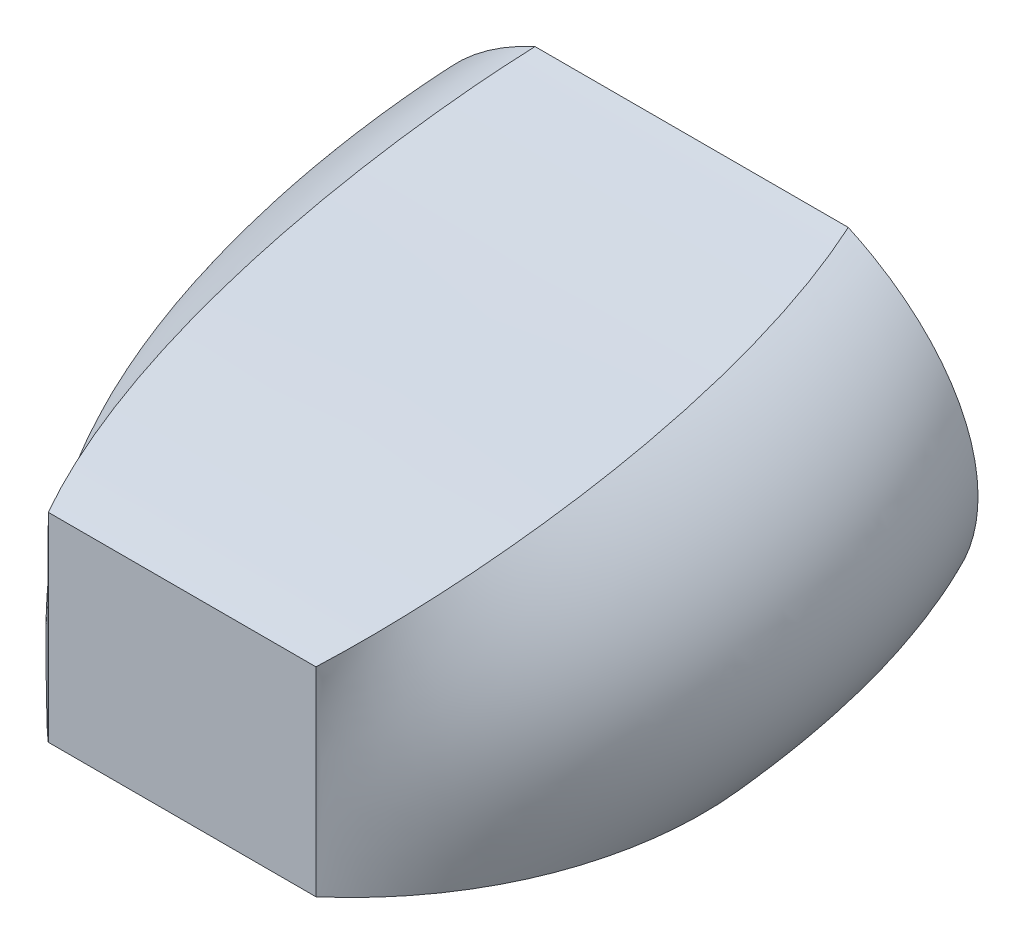
ISO-10303-21;
HEADER;
FILE_DESCRIPTION(('STEP AP214'),'2;1');
FILE_NAME('part.step','',(''),(''),'','','');
FILE_SCHEMA(('AUTOMOTIVE_DESIGN { 1 0 10303 214 1 1 1 1 }'));
ENDSEC;
DATA;
#1=APPLICATION_CONTEXT('core data for automotive mechanical design processes');
#2=APPLICATION_PROTOCOL_DEFINITION('international standard','automotive_design',2000,#1);
#3=PRODUCT_CONTEXT('',#1,'mechanical');
#4=PRODUCT('Part','Part','',(#3));
#5=PRODUCT_RELATED_PRODUCT_CATEGORY('part','',(#4));
#6=PRODUCT_DEFINITION_FORMATION('','',#4);
#7=PRODUCT_DEFINITION_CONTEXT('part definition',#1,'design');
#8=PRODUCT_DEFINITION('design','',#6,#7);
#9=PRODUCT_DEFINITION_SHAPE('','',#8);
#10=(LENGTH_UNIT() NAMED_UNIT(*) SI_UNIT(.MILLI.,.METRE.));
#11=(NAMED_UNIT(*) PLANE_ANGLE_UNIT() SI_UNIT($,.RADIAN.));
#12=(NAMED_UNIT(*) SI_UNIT($,.STERADIAN.) SOLID_ANGLE_UNIT());
#13=UNCERTAINTY_MEASURE_WITH_UNIT(LENGTH_MEASURE(1.E-05),#10,'distance_accuracy_value','');
#14=(GEOMETRIC_REPRESENTATION_CONTEXT(3) GLOBAL_UNCERTAINTY_ASSIGNED_CONTEXT((#13)) GLOBAL_UNIT_ASSIGNED_CONTEXT((#10,
#11,#12)) REPRESENTATION_CONTEXT('',''));
#15=CARTESIAN_POINT('',(0.,0.,0.));
#16=DIRECTION('',(0.,0.,1.));
#17=DIRECTION('',(1.,0.,0.));
#18=AXIS2_PLACEMENT_3D('',#15,#16,#17);
#19=CARTESIAN_POINT('',(20.015210778448,-25.1491537240854,76.2));
#20=DIRECTION('',(0.,0.,1.));
#21=DIRECTION('',(1.,0.,0.));
#22=AXIS2_PLACEMENT_3D('',#19,#20,#21);
#23=PLANE('',#22);
#24=DIRECTION('',(0.,1.,0.));
#25=VECTOR('',#24,1.);
#26=CARTESIAN_POINT('',(20.015210778448,4.63456534564599,76.2));
#27=LINE('',#26,#25);
#28=CARTESIAN_POINT('',(20.015210778448,-25.1491537240854,76.2));
#29=VERTEX_POINT('',#28);
#30=CARTESIAN_POINT('',(20.015210778448,4.63456534564599,76.2));
#31=VERTEX_POINT('',#30);
#32=EDGE_CURVE('E312',#29,#31,#27,.T.);
#33=ORIENTED_EDGE('',*,*,#32,.T.);
#34=DIRECTION('',(-1.,0.,0.));
#35=VECTOR('',#34,1.);
#36=CARTESIAN_POINT('',(-20.015210778448,4.63456534564599,76.2));
#37=LINE('',#36,#35);
#38=CARTESIAN_POINT('',(-20.015210778448,4.63456534564599,76.2));
#39=VERTEX_POINT('',#38);
#40=EDGE_CURVE('E96',#31,#39,#37,.T.);
#41=ORIENTED_EDGE('',*,*,#40,.T.);
#42=DIRECTION('',(0.,-1.,0.));
#43=VECTOR('',#42,1.);
#44=CARTESIAN_POINT('',(-20.015210778448,4.63456534564599,76.2));
#45=LINE('',#44,#43);
#46=CARTESIAN_POINT('',(-20.015210778448,-25.1491537240854,76.2));
#47=VERTEX_POINT('',#46);
#48=EDGE_CURVE('E186',#39,#47,#45,.T.);
#49=ORIENTED_EDGE('',*,*,#48,.T.);
#50=DIRECTION('',(1.,0.,0.));
#51=VECTOR('',#50,1.);
#52=CARTESIAN_POINT('',(-20.015210778448,-25.1491537240854,76.2));
#53=LINE('',#52,#51);
#54=EDGE_CURVE('E199',#47,#29,#53,.T.);
#55=ORIENTED_EDGE('',*,*,#54,.T.);
#56=EDGE_LOOP('',(#33,#41,#49,#55));
#57=FACE_BOUND('',#56,.T.);
#58=ADVANCED_FACE('F59',(#57),#23,.T.);
#59=CARTESIAN_POINT('',(0.,0.,0.));
#60=DIRECTION('',(0.,0.,1.));
#61=DIRECTION('',(1.,0.,0.));
#62=AXIS2_PLACEMENT_3D('',#59,#60,#61);
#63=PLANE('',#62);
#64=CARTESIAN_POINT('',(0.,0.,0.));
#65=DIRECTION('',(0.,0.,1.));
#66=DIRECTION('',(1.,0.,0.));
#67=AXIS2_PLACEMENT_3D('',#64,#65,#66);
#68=ELLIPSE('',#67,42.8215320166859,30.0430430974209);
#69=CARTESIAN_POINT('',(23.4252478371519,-25.1491537240854,0.));
#70=VERTEX_POINT('',#69);
#71=CARTESIAN_POINT('',(23.4252478371519,25.1491537240854,0.));
#72=VERTEX_POINT('',#71);
#73=EDGE_CURVE('E114',#70,#72,#68,.T.);
#74=ORIENTED_EDGE('',*,*,#73,.F.);
#75=DIRECTION('',(1.,0.,0.));
#76=VECTOR('',#75,1.);
#77=CARTESIAN_POINT('',(-23.4252478371519,-25.1491537240854,0.));
#78=LINE('',#77,#76);
#79=CARTESIAN_POINT('',(-23.4252478371519,-25.1491537240854,0.));
#80=VERTEX_POINT('',#79);
#81=EDGE_CURVE('E13',#80,#70,#78,.T.);
#82=ORIENTED_EDGE('',*,*,#81,.F.);
#83=CARTESIAN_POINT('',(0.,0.,0.));
#84=DIRECTION('',(0.,0.,1.));
#85=DIRECTION('',(1.,0.,0.));
#86=AXIS2_PLACEMENT_3D('',#83,#84,#85);
#87=ELLIPSE('',#86,42.8215320166859,30.0430430974209);
#88=CARTESIAN_POINT('',(-23.4252478371519,25.1491537240854,0.));
#89=VERTEX_POINT('',#88);
#90=EDGE_CURVE('E70',#89,#80,#87,.T.);
#91=ORIENTED_EDGE('',*,*,#90,.F.);
#92=DIRECTION('',(-1.,0.,0.));
#93=VECTOR('',#92,1.);
#94=CARTESIAN_POINT('',(-23.4252478371519,25.1491537240854,0.));
#95=LINE('',#94,#93);
#96=EDGE_CURVE('E111',#72,#89,#95,.T.);
#97=ORIENTED_EDGE('',*,*,#96,.F.);
#98=EDGE_LOOP('',(#74,#82,#91,#97));
#99=FACE_BOUND('',#98,.T.);
#100=ADVANCED_FACE('F113',(#99),#63,.F.);
#101=CARTESIAN_POINT('',(-23.4252478371519,25.1491537240854,0.));
#102=CARTESIAN_POINT('',(-25.3425063222502,22.8697550153699,6.92482771259224));
#103=CARTESIAN_POINT('',(-27.1969512669141,19.4506569522966,19.6986662011747));
#104=CARTESIAN_POINT('',(-27.2647219228197,14.8918595348657,38.8615590313737));
#105=CARTESIAN_POINT('',(-25.6199110200033,10.3330621174347,57.7891550462996));
#106=CARTESIAN_POINT('',(-22.636306515506,6.91396405436147,69.898422970451));
#107=CARTESIAN_POINT('',(-20.015210778448,4.63456534564599,76.2));
#108=CARTESIAN_POINT('',(-25.9671227602717,23.9837445426204,0.));
#109=CARTESIAN_POINT('',(-27.7997431154719,21.6959481546707,6.92489560917324));
#110=CARTESIAN_POINT('',(-29.4392954154369,18.2642535727463,19.698738284089));
#111=CARTESIAN_POINT('',(-29.0133491936614,13.6886607968471,38.861543002257));
#112=CARTESIAN_POINT('',(-26.727225920909,9.11306802094786,57.7890565396575));
#113=CARTESIAN_POINT('',(-23.1118719040217,5.68137343902345,69.8983430925569));
#114=CARTESIAN_POINT('',(-20.015210778448,3.39357705107385,76.2));
#115=CARTESIAN_POINT('',(-30.8500960427992,21.2068082327899,0.));
#116=CARTESIAN_POINT('',(-32.5357486452822,18.9517851471388,6.92503140233526));
#117=CARTESIAN_POINT('',(-33.7789784164681,15.569250518662,19.6988824499176));
#118=CARTESIAN_POINT('',(-32.4102154534886,11.0592043473597,38.8615109440237));
#119=CARTESIAN_POINT('',(-28.8860844550225,6.54915817605742,57.7888595263732));
#120=CARTESIAN_POINT('',(-24.0406941739738,3.16662354758071,69.8981833367687));
#121=CARTESIAN_POINT('',(-20.015210778448,0.911600461929568,76.2));
#122=CARTESIAN_POINT('',(-36.0917392739663,16.5029873541106,0.));
#123=CARTESIAN_POINT('',(-37.6894681157742,14.4258920620426,6.92520114378778));
#124=CARTESIAN_POINT('',(-38.5809736213183,11.3102491239407,19.6990626572033));
#125=CARTESIAN_POINT('',(-36.2252615922766,7.15605853980489,38.861470871232));
#126=CARTESIAN_POINT('',(-31.345192797111,3.00186795566902,57.7886132597679));
#127=CARTESIAN_POINT('',(-25.1059360811927,-0.11377498243286,69.8979836420335));
#128=CARTESIAN_POINT('',(-20.015210778448,-2.19087027450078,76.2));
#129=CARTESIAN_POINT('',(-39.4047843459119,11.9736946723841,0.));
#130=CARTESIAN_POINT('',(-41.029981902845,10.1240789461587,6.92533693694979));
#131=CARTESIAN_POINT('',(-41.7868195813737,7.34965535682046,19.6992068230318));
#132=CARTESIAN_POINT('',(-38.837163746813,3.65042390436954,38.8614388129987));
#133=CARTESIAN_POINT('',(-33.0679601616184,-0.0488075480814148,57.7884162464836));
#134=CARTESIAN_POINT('',(-25.8603218833024,-2.8232311374196,69.8978238862453));
#135=CARTESIAN_POINT('',(-20.015210778448,-4.67284686364506,76.2));
#136=CARTESIAN_POINT('',(-41.3194926440344,8.22672299423152,0.));
#137=CARTESIAN_POINT('',(-43.0286334601822,6.58660607203875,6.92543878182129));
#138=CARTESIAN_POINT('',(-43.7794828527555,4.12643068874962,19.6993149474033));
#139=CARTESIAN_POINT('',(-40.5110526097969,0.846196844364124,38.8614147693237));
#140=CARTESIAN_POINT('',(-34.2016813778221,-2.43403700002141,57.7882684865204));
#141=CARTESIAN_POINT('',(-26.362769512014,-4.89421238331052,69.8977040694042));
#142=CARTESIAN_POINT('',(-20.015210778448,-6.53432930550327,76.2));
#143=CARTESIAN_POINT('',(-42.54137331576,4.19409726075279,0.));
#144=CARTESIAN_POINT('',(-44.4114382385,2.79521848207342,6.9255406266928));
#145=CARTESIAN_POINT('',(-45.2717706161839,0.696900314054367,19.6994230717747));
#146=CARTESIAN_POINT('',(-41.8385276595824,-2.10085724330435,38.8613907256487));
#147=CARTESIAN_POINT('',(-35.1429504755822,-4.89861480066309,57.7881207265572));
#148=CARTESIAN_POINT('',(-26.7882362933481,-6.99693296868213,69.897584252563));
#149=CARTESIAN_POINT('',(-20.015210778448,-8.39581174736148,76.2));
#150=CARTESIAN_POINT('',(-42.9617026131352,0.,0.));
#151=CARTESIAN_POINT('',(-45.0817529062839,-1.13969935435774,6.92564247156431));
#152=CARTESIAN_POINT('',(-46.1851601648037,-2.84924838589436,19.6995311961461));
#153=CARTESIAN_POINT('',(-42.7652270221926,-5.12864709460984,38.8613666819737));
#154=CARTESIAN_POINT('',(-35.8615664138006,-7.40804580332535,57.787972966594));
#155=CARTESIAN_POINT('',(-27.1246418108655,-9.11759483486195,69.8974644357219));
#156=CARTESIAN_POINT('',(-20.015210778448,-10.2572941892197,76.2));
#157=CARTESIAN_POINT('',(-42.54137331576,-4.19409726075278,0.));
#158=CARTESIAN_POINT('',(-45.0048154898454,-5.07461719078892,6.92574431643582));
#159=CARTESIAN_POINT('',(-46.4914073949926,-6.39539708584311,19.6996393205175));
#160=CARTESIAN_POINT('',(-43.2715970874277,-8.15643694591534,38.8613426382987));
#161=CARTESIAN_POINT('',(-36.3466660756993,-9.91747680598761,57.7878252066308));
#162=CARTESIAN_POINT('',(-27.3676408178551,-11.2382567010418,69.8973446188807));
#163=CARTESIAN_POINT('',(-20.015210778448,-12.1187766310779,76.2));
#164=CARTESIAN_POINT('',(-41.3194926440344,-8.2267229942315,0.));
#165=CARTESIAN_POINT('',(-44.2153879628732,-8.86600478075424,6.92584616130733));
#166=CARTESIAN_POINT('',(-46.218756410373,-9.82492746053835,19.699747444889));
#167=CARTESIAN_POINT('',(-43.3771914654876,-11.1034910335838,38.8613185946237));
#168=CARTESIAN_POINT('',(-36.6091125780564,-12.3820546066293,57.7876774466676));
#169=CARTESIAN_POINT('',(-27.521578561028,-13.3409772864134,69.8972248020396));
#170=CARTESIAN_POINT('',(-20.015210778448,-13.9802590729361,76.2));
#171=CARTESIAN_POINT('',(-39.4047843459118,-11.9736946723841,0.));
#172=CARTESIAN_POINT('',(-42.8101136568814,-12.4034776548742,6.92594800617885));
#173=CARTESIAN_POINT('',(-45.4457299177999,-13.0481521286092,19.6998555692604));
#174=CARTESIAN_POINT('',(-43.1363720303489,-13.9077180935892,38.8612945509487));
#175=CARTESIAN_POINT('',(-36.6791069619698,-14.7672840585693,57.7875296867044));
#176=CARTESIAN_POINT('',(-27.5985354568234,-15.4119585323043,69.8971049851985));
#177=CARTESIAN_POINT('',(-20.015210778448,-15.8417415147943,76.2));
#178=CARTESIAN_POINT('',(-36.0917392739663,-16.5029873541105,0.));
#179=CARTESIAN_POINT('',(-40.2607695382713,-16.7052907707581,6.92608379934086));
#180=CARTESIAN_POINT('',(-43.8660663294895,-17.0087458957295,19.699999735089));
#181=CARTESIAN_POINT('',(-42.4352291129397,-17.4133527290246,38.8612624927154));
#182=CARTESIAN_POINT('',(-36.5612937309519,-17.8179595623197,57.7873326734201));
#183=CARTESIAN_POINT('',(-27.616689020723,-18.121414687291,69.8969452294103));
#184=CARTESIAN_POINT('',(-20.015210778448,-18.3237181039386,76.2000000000001));
#185=CARTESIAN_POINT('',(-30.8500960427992,-21.2068082327899,0.));
#186=CARTESIAN_POINT('',(-36.096012153355,-21.2311838558543,6.92625354079338));
#187=CARTESIAN_POINT('',(-41.0967990893205,-21.2677472904508,19.7001799423747));
#188=CARTESIAN_POINT('',(-41.0086320205606,-21.3164985365794,38.8612224199237));
#189=CARTESIAN_POINT('',(-36.1083780557253,-21.3652497827081,57.7870864068148));
#190=CARTESIAN_POINT('',(-27.5171213210158,-21.4018132173046,69.896745534675));
#191=CARTESIAN_POINT('',(-20.015210778448,-21.4261888403689,76.2));
#192=CARTESIAN_POINT('',(-25.9671227602718,-23.9837445426203,0.));
#193=CARTESIAN_POINT('',(-32.1511762920054,-23.9753468633862,6.92638933395539));
#194=CARTESIAN_POINT('',(-38.3832984600344,-23.9627503445351,19.7003241082033));
#195=CARTESIAN_POINT('',(-39.5225249978604,-23.9459549860668,38.8611903616904));
#196=CARTESIAN_POINT('',(-35.5544736551013,-23.9291596275986,57.7868893935305));
#197=CARTESIAN_POINT('',(-27.360838417073,-23.9165631087474,69.8965857788868));
#198=CARTESIAN_POINT('',(-20.015210778448,-23.9081654295132,76.2));
#199=CARTESIAN_POINT('',(-23.4252478371519,-25.1491537240854,0.));
#200=CARTESIAN_POINT('',(-30.089524333014,-25.1491537240854,6.92645723053639));
#201=CARTESIAN_POINT('',(-36.954045497384,-25.1491537240854,19.7003961911176));
#202=CARTESIAN_POINT('',(-38.7292773455823,-25.1491537240854,38.8611743325737));
#203=CARTESIAN_POINT('',(-35.2496358209404,-25.1491537240854,57.7867908868883));
#204=CARTESIAN_POINT('',(-27.271542711562,-25.1491537240854,69.8965059009927));
#205=CARTESIAN_POINT('',(-20.015210778448,-25.1491537240854,76.2));
#206=B_SPLINE_SURFACE_WITH_KNOTS('',3,3,((#101,#102,#103,#104,#105,#106,#107),(#108,#109,#110,
#111,#112,#113,#114),(#115,#116,#117,#118,#119,#120,#121),(#122,#123,#124,#125,#126,#127,#128),
(#129,#130,#131,#132,#133,#134,#135),(#136,#137,#138,#139,#140,#141,#142),(#143,#144,#145,#146,
#147,#148,#149),(#150,#151,#152,#153,#154,#155,#156),(#157,#158,#159,#160,#161,#162,#163),(#164,
#165,#166,#167,#168,#169,#170),(#171,#172,#173,#174,#175,#176,#177),(#178,#179,#180,#181,#182,
#183,#184),(#185,#186,#187,#188,#189,#190,#191),(#192,#193,#194,#195,#196,#197,#198),(#199,#200,
#201,#202,#203,#204,#205)),.UNSPECIFIED.,.F.,.F.,.F.,(4,1,1,1,1,1,1,1,1,1,1,1,4),(4,1,1,1,4),
(0.663239265490943,0.705334357304576,0.747429449118208,0.768476995025024,0.78952454093184,
0.810572086838656,0.831619632745472,0.852667178652288,0.873714724559104,0.89476227046592,
0.915809816372736,0.957904908186368,1.),(0.,0.333333333333333,0.5,0.666666666666667,1.),.UNSPECIFIED.);
#207=CARTESIAN_POINT('',(-23.4252478371519,-25.1491537240854,0.));
#208=CARTESIAN_POINT('',(-30.089524333014,-25.1491537240854,6.92645723053639));
#209=CARTESIAN_POINT('',(-36.954045497384,-25.1491537240854,19.7003961911176));
#210=CARTESIAN_POINT('',(-38.7292773455823,-25.1491537240854,38.8611743325737));
#211=CARTESIAN_POINT('',(-35.2496358209404,-25.1491537240854,57.7867908868883));
#212=CARTESIAN_POINT('',(-27.271542711562,-25.1491537240854,69.8965059009927));
#213=CARTESIAN_POINT('',(-20.015210778448,-25.1491537240854,76.2));
#214=B_SPLINE_CURVE_WITH_KNOTS('',3,(#207,#208,#209,#210,#211,#212,#213),.UNSPECIFIED.,.F.,.F.,
(4,1,1,1,4),(0.,0.333333333333333,0.5,0.666666666666667,1.),.UNSPECIFIED.);
#215=EDGE_CURVE('E125',#80,#47,#214,.T.);
#216=CARTESIAN_POINT('',(-23.4252478371519,25.1491537240854,0.));
#217=CARTESIAN_POINT('',(-25.3425063222502,22.8697550153699,6.92482771259224));
#218=CARTESIAN_POINT('',(-27.1969512669141,19.4506569522966,19.6986662011747));
#219=CARTESIAN_POINT('',(-27.2647219228197,14.8918595348657,38.8615590313737));
#220=CARTESIAN_POINT('',(-25.6199110200033,10.3330621174347,57.7891550462996));
#221=CARTESIAN_POINT('',(-22.636306515506,6.91396405436147,69.898422970451));
#222=CARTESIAN_POINT('',(-20.015210778448,4.63456534564599,76.2));
#223=B_SPLINE_CURVE_WITH_KNOTS('',3,(#216,#217,#218,#219,#220,#221,#222),.UNSPECIFIED.,.F.,.F.,
(4,1,1,1,4),(0.,0.333333333333333,0.5,0.666666666666667,1.),.UNSPECIFIED.);
#224=EDGE_CURVE('E131',#89,#39,#223,.T.);
#225=ORIENTED_EDGE('',*,*,#90,.T.);
#226=ORIENTED_EDGE('',*,*,#215,.T.);
#227=ORIENTED_EDGE('',*,*,#48,.F.);
#228=ORIENTED_EDGE('',*,*,#224,.F.);
#229=EDGE_LOOP('',(#225,#226,#227,#228));
#230=FACE_BOUND('',#229,.T.);
#231=ADVANCED_FACE('F159',(#230),#206,.T.);
#232=CARTESIAN_POINT('',(23.4252478371519,25.1491537240854,0.));
#233=CARTESIAN_POINT('',(25.3522822273266,22.8697550153699,6.92324794817762));
#234=CARTESIAN_POINT('',(27.2182634915339,19.4506569522966,19.6969890324395));
#235=CARTESIAN_POINT('',(27.2902486570107,14.8918595348657,38.8619319842931));
#236=CARTESIAN_POINT('',(25.6406791851697,10.3330621174347,57.7914470216178));
#237=CARTESIAN_POINT('',(22.6456111250246,6.91396405436147,69.900281506665));
#238=CARTESIAN_POINT('',(20.015210778448,4.63456534564599,76.2));
#239=CARTESIAN_POINT('',(19.5210398642932,25.1491537240854,0.));
#240=CARTESIAN_POINT('',(21.1277165148619,22.8697550153699,6.92337959521217));
#241=CARTESIAN_POINT('',(22.6836622616633,19.4506569522966,19.6971287965008));
#242=CARTESIAN_POINT('',(22.7440011086915,14.8918595348657,38.8619009048831));
#243=CARTESIAN_POINT('',(21.3689633347386,10.3330621174347,57.7912560236746));
#244=CARTESIAN_POINT('',(18.8721179883137,6.91396405436147,69.9001266286472));
#245=CARTESIAN_POINT('',(16.6793423153733,4.63456534564599,76.2));
#246=CARTESIAN_POINT('',(11.712623918576,25.1491537240854,0.));
#247=CARTESIAN_POINT('',(12.6785850899324,22.8697550153699,6.92364288928129));
#248=CARTESIAN_POINT('',(13.6144598019219,19.4506569522967,19.6974083246233));
#249=CARTESIAN_POINT('',(13.6515060120531,14.8918595348657,38.8618387460633));
#250=CARTESIAN_POINT('',(12.8255316338764,10.3330621174347,57.7908740277883));
#251=CARTESIAN_POINT('',(11.3251317148919,6.91396405436147,69.8998168726116));
#252=CARTESIAN_POINT('',(10.007605389224,4.63456534564599,76.2000000000001));
#253=CARTESIAN_POINT('',(0.,25.1491537240853,0.));
#254=CARTESIAN_POINT('',(0.0048879525382143,22.8697550153699,6.92403783038491));
#255=CARTESIAN_POINT('',(0.0106561123099167,19.4506569522966,19.6978276168071));
#256=CARTESIAN_POINT('',(0.0127633670955166,14.8918595348657,38.8617455078333));
#257=CARTESIAN_POINT('',(0.0103840825831753,10.3330621174347,57.7903010339586));
#258=CARTESIAN_POINT('',(0.00465230475926562,6.91396405436147,69.8993522385579));
#259=CARTESIAN_POINT('',(0.,4.63456534564599,76.1999999999998));
#260=CARTESIAN_POINT('',(-11.7126239185759,25.1491537240854,0.));
#261=CARTESIAN_POINT('',(-12.668809184856,22.8697550153699,6.9244327714886));
#262=CARTESIAN_POINT('',(-13.5931475773021,19.4506569522967,19.6982469089909));
#263=CARTESIAN_POINT('',(-13.6259792778621,14.8918595348657,38.8616522696036));
#264=CARTESIAN_POINT('',(-12.8047634687101,10.3330621174347,57.7897280401293));
#265=CARTESIAN_POINT('',(-11.3158271053734,6.91396405436147,69.8988876045046));
#266=CARTESIAN_POINT('',(-10.007605389224,4.63456534564599,76.2000000000001));
#267=CARTESIAN_POINT('',(-19.5210398642932,25.1491537240854,0.));
#268=CARTESIAN_POINT('',(-21.1179406097855,22.8697550153699,6.92469606555768));
#269=CARTESIAN_POINT('',(-22.6623500370434,19.4506569522966,19.6985264371134));
#270=CARTESIAN_POINT('',(-22.7184743745005,14.8918595348657,38.8615901107836));
#271=CARTESIAN_POINT('',(-21.3481951695722,10.3330621174347,57.7893460442428));
#272=CARTESIAN_POINT('',(-18.8628133787951,6.91396405436147,69.8985778484688));
#273=CARTESIAN_POINT('',(-16.6793423153733,4.63456534564599,76.2));
#274=CARTESIAN_POINT('',(-23.4252478371519,25.1491537240854,0.));
#275=CARTESIAN_POINT('',(-25.3425063222502,22.8697550153699,6.92482771259224));
#276=CARTESIAN_POINT('',(-27.1969512669141,19.4506569522966,19.6986662011747));
#277=CARTESIAN_POINT('',(-27.2647219228197,14.8918595348657,38.8615590313737));
#278=CARTESIAN_POINT('',(-25.6199110200033,10.3330621174347,57.7891550462996));
#279=CARTESIAN_POINT('',(-22.636306515506,6.91396405436147,69.898422970451));
#280=CARTESIAN_POINT('',(-20.015210778448,4.63456534564599,76.2));
#281=B_SPLINE_SURFACE_WITH_KNOTS('',3,3,((#232,#233,#234,#235,#236,#237,#238),(#239,#240,#241,
#242,#243,#244,#245),(#246,#247,#248,#249,#250,#251,#252),(#253,#254,#255,#256,#257,#258,#259),
(#260,#261,#262,#263,#264,#265,#266),(#267,#268,#269,#270,#271,#272,#273),(#274,#275,#276,#277,
#278,#279,#280)),.UNSPECIFIED.,.F.,.F.,.F.,(4,1,1,1,4),(4,1,1,1,4),(0.336760734509057,
0.418380367254528,0.5,0.581619632745472,0.663239265490943),(0.,0.333333333333333,0.5,
0.666666666666667,1.),.UNSPECIFIED.);
#282=CARTESIAN_POINT('',(23.4252478371519,25.1491537240854,0.));
#283=CARTESIAN_POINT('',(25.3522822273266,22.8697550153699,6.92324794817762));
#284=CARTESIAN_POINT('',(27.2182634915339,19.4506569522966,19.6969890324395));
#285=CARTESIAN_POINT('',(27.2902486570107,14.8918595348657,38.8619319842931));
#286=CARTESIAN_POINT('',(25.6406791851697,10.3330621174347,57.7914470216178));
#287=CARTESIAN_POINT('',(22.6456111250246,6.91396405436147,69.900281506665));
#288=CARTESIAN_POINT('',(20.015210778448,4.63456534564599,76.2));
#289=B_SPLINE_CURVE_WITH_KNOTS('',3,(#282,#283,#284,#285,#286,#287,#288),.UNSPECIFIED.,.F.,.F.,
(4,1,1,1,4),(0.,0.333333333333333,0.5,0.666666666666667,1.),.UNSPECIFIED.);
#290=EDGE_CURVE('E102',#72,#31,#289,.T.);
#291=ORIENTED_EDGE('',*,*,#96,.T.);
#292=ORIENTED_EDGE('',*,*,#224,.T.);
#293=ORIENTED_EDGE('',*,*,#40,.F.);
#294=ORIENTED_EDGE('',*,*,#290,.F.);
#295=EDGE_LOOP('',(#291,#292,#293,#294));
#296=FACE_BOUND('',#295,.T.);
#297=ADVANCED_FACE('F129',(#296),#281,.T.);
#298=CARTESIAN_POINT('',(23.4252478371519,-25.1491537240854,0.));
#299=CARTESIAN_POINT('',(30.0993002380904,-25.1491537240854,6.92161843023346));
#300=CARTESIAN_POINT('',(36.9753577220038,-25.1491537240854,19.6952590424967));
#301=CARTESIAN_POINT('',(38.7548040797733,-25.1491537240854,38.8623166830931));
#302=CARTESIAN_POINT('',(35.2704039861068,-25.1491537240854,57.7938111810291));
#303=CARTESIAN_POINT('',(27.2808473210805,-25.1491537240854,69.9021985761233));
#304=CARTESIAN_POINT('',(20.015210778448,-25.1491537240854,76.2));
#305=CARTESIAN_POINT('',(25.9671227602717,-23.9837445426204,0.));
#306=CARTESIAN_POINT('',(32.1609521970818,-23.9753468633862,6.92168632681447));
#307=CARTESIAN_POINT('',(38.4046106846542,-23.9627503445351,19.6953311254109));
#308=CARTESIAN_POINT('',(39.5480517320515,-23.9459549860668,38.8623006539764));
#309=CARTESIAN_POINT('',(35.5752418202677,-23.9291596275986,57.793712674387));
#310=CARTESIAN_POINT('',(27.3701430265915,-23.9165631087474,69.9021186982292));
#311=CARTESIAN_POINT('',(20.015210778448,-23.9081654295132,76.2));
#312=CARTESIAN_POINT('',(30.8500960427991,-21.2068082327899,0.));
#313=CARTESIAN_POINT('',(36.1057880584314,-21.2311838558542,6.92182211997648));
#314=CARTESIAN_POINT('',(41.1181113139404,-21.2677472904507,19.6954752912395));
#315=CARTESIAN_POINT('',(41.0341587547516,-21.3164985365794,38.8622685957431));
#316=CARTESIAN_POINT('',(36.1291462208917,-21.3652497827081,57.7935156611027));
#317=CARTESIAN_POINT('',(27.5264259305343,-21.4018132173046,69.901958942441));
#318=CARTESIAN_POINT('',(20.015210778448,-21.426188840369,76.2));
#319=CARTESIAN_POINT('',(36.0917392739663,-16.5029873541106,0.));
#320=CARTESIAN_POINT('',(40.2705454433477,-16.7052907707581,6.92199186142901));
#321=CARTESIAN_POINT('',(43.8873785541094,-17.0087458957295,19.6956554985252));
#322=CARTESIAN_POINT('',(42.4607558471308,-17.4133527290246,38.8622285229514));
#323=CARTESIAN_POINT('',(36.5820618961183,-17.8179595623197,57.7932693944974));
#324=CARTESIAN_POINT('',(27.6259936302415,-18.121414687291,69.9017592477058));
#325=CARTESIAN_POINT('',(20.015210778448,-18.3237181039386,76.2000000000001));
#326=CARTESIAN_POINT('',(39.4047843459118,-11.9736946723841,0.));
#327=CARTESIAN_POINT('',(42.8198895619579,-12.4034776548742,6.92212765459101));
#328=CARTESIAN_POINT('',(45.4670421424198,-13.0481521286092,19.6957996643538));
#329=CARTESIAN_POINT('',(43.16189876454,-13.9077180935892,38.8621964647181));
#330=CARTESIAN_POINT('',(36.6998751271361,-14.7672840585693,57.7930723812131));
#331=CARTESIAN_POINT('',(27.6078400663419,-15.4119585323043,69.9015994919176));
#332=CARTESIAN_POINT('',(20.015210778448,-15.8417415147943,76.2));
#333=CARTESIAN_POINT('',(41.3194926440344,-8.22672299423152,0.));
#334=CARTESIAN_POINT('',(44.2251638679496,-8.86600478075425,6.92222949946252));
#335=CARTESIAN_POINT('',(46.2400686349928,-9.82492746053835,19.6959077887252));
#336=CARTESIAN_POINT('',(43.4027181996786,-11.1034910335838,38.8621724210431));
#337=CARTESIAN_POINT('',(36.6298807432227,-12.3820546066293,57.7929246212499));
#338=CARTESIAN_POINT('',(27.5308831705465,-13.3409772864134,69.9014796750764));
#339=CARTESIAN_POINT('',(20.015210778448,-13.9802590729361,76.2));
#340=CARTESIAN_POINT('',(42.54137331576,-4.19409726075278,0.));
#341=CARTESIAN_POINT('',(45.0145913949218,-5.0746171907889,6.92233134433403));
#342=CARTESIAN_POINT('',(46.5127196196125,-6.3953970858431,19.6960159130966));
#343=CARTESIAN_POINT('',(43.2971238216187,-8.15643694591534,38.8621483773681));
#344=CARTESIAN_POINT('',(36.3674342408657,-9.91747680598761,57.7927768612866));
#345=CARTESIAN_POINT('',(27.3769454273736,-11.2382567010418,69.9013598582353));
#346=CARTESIAN_POINT('',(20.015210778448,-12.1187766310779,76.2));
#347=CARTESIAN_POINT('',(42.9617026131352,0.,0.));
#348=CARTESIAN_POINT('',(45.0915288113604,-1.13969935435775,6.92243318920554));
#349=CARTESIAN_POINT('',(46.2064723894235,-2.84924838589437,19.6961240374681));
#350=CARTESIAN_POINT('',(42.7907537563837,-5.12864709460984,38.8621243336931));
#351=CARTESIAN_POINT('',(35.8823345789669,-7.40804580332535,57.7926291013234));
#352=CARTESIAN_POINT('',(27.133946420384,-9.11759483486195,69.9012400413941));
#353=CARTESIAN_POINT('',(20.015210778448,-10.2572941892197,76.2));
#354=CARTESIAN_POINT('',(42.54137331576,4.19409726075277,0.));
#355=CARTESIAN_POINT('',(44.4212141435764,2.79521848207341,6.92253503407705));
#356=CARTESIAN_POINT('',(45.2930828408037,0.696900314054363,19.6962321618395));
#357=CARTESIAN_POINT('',(41.8640543937734,-2.10085724330435,38.8621002900181));
#358=CARTESIAN_POINT('',(35.1637186407486,-4.8986148006631,57.7924813413602));
#359=CARTESIAN_POINT('',(26.7975409028666,-6.99693296868212,69.901120224553));
#360=CARTESIAN_POINT('',(20.015210778448,-8.39581174736148,76.2));
#361=CARTESIAN_POINT('',(41.3194926440344,8.22672299423154,0.));
#362=CARTESIAN_POINT('',(43.0384093652586,6.58660607203878,6.92263687894856));
#363=CARTESIAN_POINT('',(43.8007950773753,4.12643068874964,19.6963402862109));
#364=CARTESIAN_POINT('',(40.5365793439879,0.84619684436414,38.8620762463431));
#365=CARTESIAN_POINT('',(34.2224495429884,-2.4340370000214,57.792333581397));
#366=CARTESIAN_POINT('',(26.3720741215325,-4.89421238331052,69.9010004077118));
#367=CARTESIAN_POINT('',(20.015210778448,-6.53432930550327,76.2));
#368=CARTESIAN_POINT('',(39.4047843459119,11.9736946723841,0.));
#369=CARTESIAN_POINT('',(41.0397578079215,10.1240789461587,6.92273872382007));
#370=CARTESIAN_POINT('',(41.8081318059936,7.34965535682045,19.6964484105824));
#371=CARTESIAN_POINT('',(38.862690481004,3.65042390436954,38.8620522026681));
#372=CARTESIAN_POINT('',(33.0887283267847,-0.0488075480814165,57.7921858214339));
#373=CARTESIAN_POINT('',(25.869626492821,-2.8232311374196,69.9008805908707));
#374=CARTESIAN_POINT('',(20.015210778448,-4.67284686364506,76.2));
#375=CARTESIAN_POINT('',(36.0917392739662,16.5029873541106,0.));
#376=CARTESIAN_POINT('',(37.6992440208505,14.4258920620426,6.92287451698209));
#377=CARTESIAN_POINT('',(38.6022858459381,11.3102491239407,19.696592576411));
#378=CARTESIAN_POINT('',(36.2507883264676,7.1560585398049,38.8620201444348));
#379=CARTESIAN_POINT('',(31.3659609622773,3.00186795566902,57.7919888081496));
#380=CARTESIAN_POINT('',(25.1152406907112,-0.113774982432855,69.9007208350826));
#381=CARTESIAN_POINT('',(20.015210778448,-2.19087027450078,76.2000000000001));
#382=CARTESIAN_POINT('',(30.8500960427992,21.2068082327899,0.));
#383=CARTESIAN_POINT('',(32.5455245503586,18.9517851471388,6.9230442584346));
#384=CARTESIAN_POINT('',(33.800290641088,15.569250518662,19.6967727836967));
#385=CARTESIAN_POINT('',(32.4357421876797,11.0592043473598,38.8619800716431));
#386=CARTESIAN_POINT('',(28.9068526201888,6.54915817605743,57.7917425415442));
#387=CARTESIAN_POINT('',(24.0499987834924,3.16662354758072,69.9005211403473));
#388=CARTESIAN_POINT('',(20.015210778448,0.91160046192957,76.2));
#389=CARTESIAN_POINT('',(25.9671227602717,23.9837445426204,0.));
#390=CARTESIAN_POINT('',(27.8095190205483,21.6959481546707,6.92318005159661));
#391=CARTESIAN_POINT('',(29.4606076400567,18.2642535727463,19.6969169495252));
#392=CARTESIAN_POINT('',(29.0388759278524,13.6886607968471,38.8619480134098));
#393=CARTESIAN_POINT('',(26.7479940860753,9.11306802094787,57.7915455282599));
#394=CARTESIAN_POINT('',(23.1211765135402,5.68137343902346,69.9003613845591));
#395=CARTESIAN_POINT('',(20.015210778448,3.39357705107385,76.2));
#396=CARTESIAN_POINT('',(23.4252478371519,25.1491537240854,0.));
#397=CARTESIAN_POINT('',(25.3522822273266,22.8697550153699,6.92324794817762));
#398=CARTESIAN_POINT('',(27.2182634915339,19.4506569522966,19.6969890324395));
#399=CARTESIAN_POINT('',(27.2902486570107,14.8918595348657,38.8619319842931));
#400=CARTESIAN_POINT('',(25.6406791851697,10.3330621174347,57.7914470216178));
#401=CARTESIAN_POINT('',(22.6456111250246,6.91396405436147,69.900281506665));
#402=CARTESIAN_POINT('',(20.015210778448,4.63456534564599,76.2));
#403=B_SPLINE_SURFACE_WITH_KNOTS('',3,3,((#298,#299,#300,#301,#302,#303,#304),(#305,#306,#307,
#308,#309,#310,#311),(#312,#313,#314,#315,#316,#317,#318),(#319,#320,#321,#322,#323,#324,#325),
(#326,#327,#328,#329,#330,#331,#332),(#333,#334,#335,#336,#337,#338,#339),(#340,#341,#342,#343,
#344,#345,#346),(#347,#348,#349,#350,#351,#352,#353),(#354,#355,#356,#357,#358,#359,#360),(#361,
#362,#363,#364,#365,#366,#367),(#368,#369,#370,#371,#372,#373,#374),(#375,#376,#377,#378,#379,
#380,#381),(#382,#383,#384,#385,#386,#387,#388),(#389,#390,#391,#392,#393,#394,#395),(#396,#397,
#398,#399,#400,#401,#402)),.UNSPECIFIED.,.F.,.F.,.F.,(4,1,1,1,1,1,1,1,1,1,1,1,4),(4,1,1,1,4),
(0.,0.0420950918136321,0.0841901836272642,0.10523772953408,0.126285275440896,0.147332821347712,
0.168380367254528,0.189427913161344,0.21047545906816,0.231523004974976,0.252570550881792,
0.294665642695425,0.336760734509057),(0.,0.333333333333333,0.5,0.666666666666667,1.),.UNSPECIFIED.);
#404=CARTESIAN_POINT('',(20.015210778448,-25.1491537240854,76.2));
#405=CARTESIAN_POINT('',(27.2808473210805,-25.1491537240854,69.9021985761233));
#406=CARTESIAN_POINT('',(35.2704039861068,-25.1491537240854,57.7938111810291));
#407=CARTESIAN_POINT('',(38.7548040797733,-25.1491537240854,38.8623166830931));
#408=CARTESIAN_POINT('',(36.9753577220038,-25.1491537240854,19.6952590424967));
#409=CARTESIAN_POINT('',(30.0993002380904,-25.1491537240854,6.92161843023346));
#410=CARTESIAN_POINT('',(23.4252478371519,-25.1491537240854,0.));
#411=B_SPLINE_CURVE_WITH_KNOTS('',3,(#404,#405,#406,#407,#408,#409,#410),.UNSPECIFIED.,.F.,.F.,
(4,1,1,1,4),(0.,0.333333333333333,0.5,0.666666666666667,1.),.UNSPECIFIED.);
#412=EDGE_CURVE('E79',#70,#29,#411,.F.);
#413=ORIENTED_EDGE('',*,*,#73,.T.);
#414=ORIENTED_EDGE('',*,*,#290,.T.);
#415=ORIENTED_EDGE('',*,*,#32,.F.);
#416=ORIENTED_EDGE('',*,*,#412,.F.);
#417=EDGE_LOOP('',(#413,#414,#415,#416));
#418=FACE_BOUND('',#417,.T.);
#419=ADVANCED_FACE('F124',(#418),#403,.T.);
#420=CARTESIAN_POINT('',(-14.411129037458,-25.1491537240854,36.4830804338761));
#421=DIRECTION('',(0.,-1.,0.));
#422=DIRECTION('',(0.,0.,-1.));
#423=AXIS2_PLACEMENT_3D('',#420,#421,#422);
#424=PLANE('',#423);
#425=ORIENTED_EDGE('',*,*,#412,.T.);
#426=ORIENTED_EDGE('',*,*,#54,.F.);
#427=ORIENTED_EDGE('',*,*,#215,.F.);
#428=ORIENTED_EDGE('',*,*,#81,.T.);
#429=EDGE_LOOP('',(#425,#426,#427,#428));
#430=FACE_BOUND('',#429,.T.);
#431=ADVANCED_FACE('F204',(#430),#424,.T.);
#432=CLOSED_SHELL('',(#58,#100,#231,#297,#419,#431));
#433=MANIFOLD_SOLID_BREP('B2',#432);
#434=ADVANCED_BREP_SHAPE_REPRESENTATION('',(#18,#433),#14);
#435=SHAPE_DEFINITION_REPRESENTATION(#9,#434);
ENDSEC;
END-ISO-10303-21;
